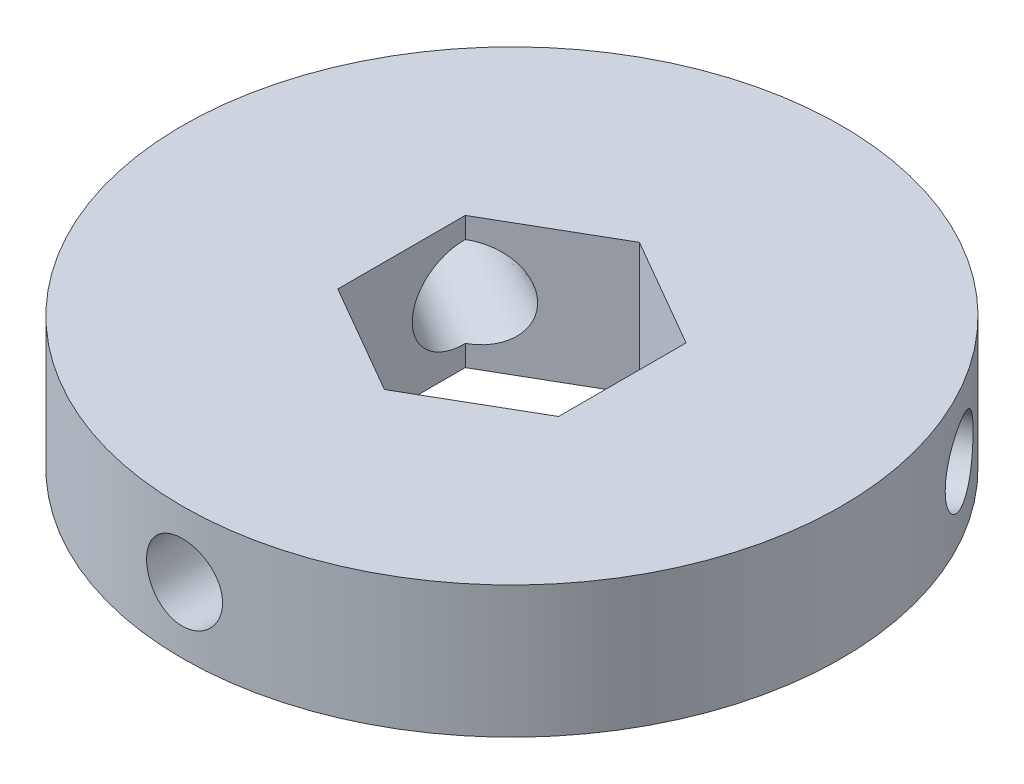
ISO-10303-21;
HEADER;
FILE_DESCRIPTION(('STEP AP214'),'2;1');
FILE_NAME('part.step','',(''),(''),'','','');
FILE_SCHEMA(('AUTOMOTIVE_DESIGN { 1 0 10303 214 1 1 1 1 }'));
ENDSEC;
DATA;
#1=APPLICATION_CONTEXT('core data for automotive mechanical design processes');
#2=APPLICATION_PROTOCOL_DEFINITION('international standard','automotive_design',2000,#1);
#3=PRODUCT_CONTEXT('',#1,'mechanical');
#4=PRODUCT('Part','Part','',(#3));
#5=PRODUCT_RELATED_PRODUCT_CATEGORY('part','',(#4));
#6=PRODUCT_DEFINITION_FORMATION('','',#4);
#7=PRODUCT_DEFINITION_CONTEXT('part definition',#1,'design');
#8=PRODUCT_DEFINITION('design','',#6,#7);
#9=PRODUCT_DEFINITION_SHAPE('','',#8);
#10=(LENGTH_UNIT() NAMED_UNIT(*) SI_UNIT(.MILLI.,.METRE.));
#11=(NAMED_UNIT(*) PLANE_ANGLE_UNIT() SI_UNIT($,.RADIAN.));
#12=(NAMED_UNIT(*) SI_UNIT($,.STERADIAN.) SOLID_ANGLE_UNIT());
#13=UNCERTAINTY_MEASURE_WITH_UNIT(LENGTH_MEASURE(1.E-05),#10,'distance_accuracy_value','');
#14=(GEOMETRIC_REPRESENTATION_CONTEXT(3) GLOBAL_UNCERTAINTY_ASSIGNED_CONTEXT((#13)) GLOBAL_UNIT_ASSIGNED_CONTEXT((#10,
#11,#12)) REPRESENTATION_CONTEXT('',''));
#15=CARTESIAN_POINT('',(0.,0.,0.));
#16=DIRECTION('',(0.,0.,1.));
#17=DIRECTION('',(1.,0.,0.));
#18=AXIS2_PLACEMENT_3D('',#15,#16,#17);
#19=CARTESIAN_POINT('',(0.,2.,0.));
#20=DIRECTION('',(0.,-1.,0.));
#21=DIRECTION('',(0.,0.,-1.));
#22=AXIS2_PLACEMENT_3D('',#19,#20,#21);
#23=CYLINDRICAL_SURFACE('',#22,10.);
#24=CARTESIAN_POINT('',(0.,2.,0.));
#25=DIRECTION('',(0.,1.,0.));
#26=DIRECTION('',(0.,0.,1.));
#27=AXIS2_PLACEMENT_3D('',#24,#25,#26);
#28=CIRCLE('',#27,10.);
#29=CARTESIAN_POINT('',(0.,2.,10.));
#30=VERTEX_POINT('',#29);
#31=EDGE_CURVE('E146',#30,#30,#28,.T.);
#32=ORIENTED_EDGE('',*,*,#31,.F.);
#33=EDGE_LOOP('',(#32));
#34=FACE_BOUND('',#33,.T.);
#35=CARTESIAN_POINT('',(0.,-2.,0.));
#36=DIRECTION('',(0.,1.,0.));
#37=DIRECTION('',(0.,0.,1.));
#38=AXIS2_PLACEMENT_3D('',#35,#36,#37);
#39=CIRCLE('',#38,10.);
#40=CARTESIAN_POINT('',(0.,-2.,10.));
#41=VERTEX_POINT('',#40);
#42=EDGE_CURVE('E145',#41,#41,#39,.T.);
#43=ORIENTED_EDGE('',*,*,#42,.T.);
#44=EDGE_LOOP('',(#43));
#45=FACE_BOUND('',#44,.T.);
#46=CARTESIAN_POINT('',(-0.831466883380527,-0.797352041237193,9.96537319029456));
#47=CARTESIAN_POINT('',(-0.87623135680235,-0.750857048698407,9.96163827593498));
#48=CARTESIAN_POINT('',(-0.917108542852066,-0.700561462114175,9.95792348569143));
#49=CARTESIAN_POINT('',(-0.98989355918561,-0.593769515069177,9.95095250017821));
#50=CARTESIAN_POINT('',(-1.02179215921711,-0.537266855889508,9.94769677854763));
#51=CARTESIAN_POINT('',(-1.07565928041342,-0.419672101911003,9.94201657930877));
#52=CARTESIAN_POINT('',(-1.09762891993868,-0.358580524894907,9.9395920080903));
#53=CARTESIAN_POINT('',(-1.13098213369277,-0.233555640429572,9.93585245919196));
#54=CARTESIAN_POINT('',(-1.14236836978836,-0.169623051773581,9.93453720251244));
#55=CARTESIAN_POINT('',(-1.15418879847582,-0.0410990034503923,9.93317089798296));
#56=CARTESIAN_POINT('',(-1.15468355758256,0.0234868133257319,9.933112858889));
#57=CARTESIAN_POINT('',(-1.14486019420359,0.151820507987677,9.93424978804994));
#58=CARTESIAN_POINT('',(-1.13454188586373,0.215568371451754,9.93544477784179));
#59=CARTESIAN_POINT('',(-1.10344545826133,0.340232697401939,9.9389460974761));
#60=CARTESIAN_POINT('',(-1.08269708389839,0.401156676527566,9.94124926617163));
#61=CARTESIAN_POINT('',(-1.03136149359407,0.518666218396538,9.94670579047661));
#62=CARTESIAN_POINT('',(-1.00077395599945,0.575251639232661,9.94985917387998));
#63=CARTESIAN_POINT('',(-0.930430663575174,0.682831863623349,9.95668368786477));
#64=CARTESIAN_POINT('',(-0.89062363790302,0.733792958102964,9.96035766746816));
#65=CARTESIAN_POINT('',(-0.803060205671823,0.828347101472137,9.96779917254997));
#66=CARTESIAN_POINT('',(-0.755303498129143,0.871939871262885,9.97156670156568));
#67=CARTESIAN_POINT('',(-0.652843774194066,0.950803816118998,9.97879974375043));
#68=CARTESIAN_POINT('',(-0.598098651713221,0.986020499490011,9.98226319146768));
#69=CARTESIAN_POINT('',(-0.483441352062913,1.04677761167011,9.98847217860723));
#70=CARTESIAN_POINT('',(-0.42352921296792,1.07231811177312,9.99121772331898));
#71=CARTESIAN_POINT('',(-0.30028371262004,1.1129719978223,9.99568035658648));
#72=CARTESIAN_POINT('',(-0.236953247847999,1.12809406666803,9.99739830140385));
#73=CARTESIAN_POINT('',(-0.108633066778872,1.14750295635954,9.99961572818127));
#74=CARTESIAN_POINT('',(-0.0436434026426832,1.15179011740389,10.0001152483979));
#75=CARTESIAN_POINT('',(0.0858363813923547,1.14940928921731,9.99984024739126));
#76=CARTESIAN_POINT('',(0.150327430578437,1.14279083905639,9.99907148735027));
#77=CARTESIAN_POINT('',(0.277274862998776,1.11888616963386,9.99635689712735));
#78=CARTESIAN_POINT('',(0.339731239195363,1.10159991347781,9.99441106287454));
#79=CARTESIAN_POINT('',(0.460855699955949,1.05685539794539,9.98955902702158));
#80=CARTESIAN_POINT('',(0.519523256622255,1.02939572467814,9.98665269193811));
#81=CARTESIAN_POINT('',(0.631423258813606,0.965082406181372,9.98020289726765));
#82=CARTESIAN_POINT('',(0.684655518615473,0.928228440100788,9.9766594159209));
#83=CARTESIAN_POINT('',(0.784431952376467,0.845964962773647,9.96931215974208));
#84=CARTESIAN_POINT('',(0.830944424786302,0.800517093457773,9.96550726857214));
#85=CARTESIAN_POINT('',(0.915678947661903,0.702442913407562,9.95807942654568));
#86=CARTESIAN_POINT('',(0.953900936144161,0.649816549008253,9.95445647704959));
#87=CARTESIAN_POINT('',(1.02097931127845,0.538822646272109,9.94780088270349));
#88=CARTESIAN_POINT('',(1.0498304044078,0.48045188715767,9.94476857188498));
#89=CARTESIAN_POINT('',(1.09728936960824,0.359646246058115,9.93964433577026));
#90=CARTESIAN_POINT('',(1.11589770658622,0.297211548674334,9.93755236779376));
#91=CARTESIAN_POINT('',(1.14222732363463,0.170485527314597,9.9345605377322));
#92=CARTESIAN_POINT('',(1.15001894684696,0.106209000462936,9.93365297556917));
#93=CARTESIAN_POINT('',(1.15470761139663,-0.0227443445651024,9.9331091033533));
#94=CARTESIAN_POINT('',(1.15160504938089,-0.0874211480822014,9.93347274701707));
#95=CARTESIAN_POINT('',(1.13464641472022,-0.214971651072027,9.9354239074038));
#96=CARTESIAN_POINT('',(1.12084855713302,-0.277853207025768,9.93700479827652));
#97=CARTESIAN_POINT('',(1.08297843920569,-0.400404860628441,9.94120303282282));
#98=CARTESIAN_POINT('',(1.05890598532181,-0.460074897757776,9.94382039602048));
#99=CARTESIAN_POINT('',(1.00108962642963,-0.574730689842418,9.94980717820899));
#100=CARTESIAN_POINT('',(0.967314550475386,-0.629700594349948,9.95317901319412));
#101=CARTESIAN_POINT('',(0.89108432443883,-0.73322404491863,9.9602926485895));
#102=CARTESIAN_POINT('',(0.848628765494832,-0.781777288569555,9.96403446642211));
#103=CARTESIAN_POINT('',(0.755880755283127,-0.871464597261614,9.97150037066761));
#104=CARTESIAN_POINT('',(0.705533025175442,-0.912541540803229,9.97522412490221));
#105=CARTESIAN_POINT('',(0.59864096128138,-0.985685693056444,9.98220883162894));
#106=CARTESIAN_POINT('',(0.542096559036923,-1.01775280221745,9.98546977900729));
#107=CARTESIAN_POINT('',(0.424290318680589,-1.07201848393992,9.99116898730048));
#108=CARTESIAN_POINT('',(0.363020122611525,-1.09419907912126,9.99360574761098));
#109=CARTESIAN_POINT('',(0.237596135410269,-1.12796246853576,9.99737372093048));
#110=CARTESIAN_POINT('',(0.17344252984597,-1.13954594374724,9.99870500497766));
#111=CARTESIAN_POINT('',(0.04437228090468,-1.15175045134875,10.0001088796741));
#112=CARTESIAN_POINT('',(-0.0205397782112637,-1.15241937047757,10.0001869685917));
#113=CARTESIAN_POINT('',(-0.149565892844728,-1.14289587250054,9.99908961984763));
#114=CARTESIAN_POINT('',(-0.213679784145377,-1.1327012564824,9.99791392840558));
#115=CARTESIAN_POINT('',(-0.339165742569385,-1.10177454477811,9.99444365695216));
#116=CARTESIAN_POINT('',(-0.400542024888607,-1.08105930352783,9.99215086681288));
#117=CARTESIAN_POINT('',(-0.518898016790839,-1.02970390722413,9.98670370541665));
#118=CARTESIAN_POINT('',(-0.575882102139896,-0.999073792420861,9.98355020625709));
#119=CARTESIAN_POINT('',(-0.666499875857055,-0.940104753797526,9.97783206554103));
#120=CARTESIAN_POINT('',(-0.701749787932262,-0.914196421597137,9.97540415923138));
#121=CARTESIAN_POINT('',(-0.769082504346506,-0.858556577954024,9.97043882546524));
#122=CARTESIAN_POINT('',(-0.801165289645521,-0.828825043529578,9.96790139735046));
#123=CARTESIAN_POINT('',(-0.831466883380527,-0.797352041237193,9.96537319029456));
#124=B_SPLINE_CURVE_WITH_KNOTS('',3,(#46,#47,#48,#49,#50,#51,#52,#53,#54,#55,#56,#57,#58,#59,
#60,#61,#62,#63,#64,#65,#66,#67,#68,#69,#70,#71,#72,#73,#74,#75,#76,#77,#78,#79,#80,#81,#82,#83,
#84,#85,#86,#87,#88,#89,#90,#91,#92,#93,#94,#95,#96,#97,#98,#99,#100,#101,#102,#103,#104,#105,
#106,#107,#108,#109,#110,#111,#112,#113,#114,#115,#116,#117,#118,#119,#120,#121,#122,#123),
.UNSPECIFIED.,.T.,.F.,(4,2,2,2,2,2,2,2,2,2,2,2,2,2,2,2,2,2,2,2,2,2,2,2,2,2,2,2,2,2,2,2,2,2,2,2,
2,2,4),(0.,0.193791440646984,0.387781383006681,0.581749469625854,0.775668757479188,
0.968509403704672,1.1613533645142,1.35365045859547,1.54595383972269,1.73935347644252,
1.93276043714991,2.12739317401012,2.32202447679227,2.51649337364121,2.7109561644056,
2.90453803488596,3.09812057486987,3.29173002885138,3.48534609622298,3.67984767031398,
3.87435069853895,4.06896340920976,4.2635672859056,4.45689959233673,4.65022485979568,
4.8425051738159,5.03478911000247,5.2276978274229,5.42061563318102,5.6149506155124,
5.80928774498675,6.00397682463103,6.19865339254056,6.3924756018291,6.5863370505552,
6.77988890107313,6.97324536218295,7.10442425819293,7.23560394277163),.UNSPECIFIED.);
#125=CARTESIAN_POINT('',(-0.831466883380527,-0.797352041237193,9.96537319029456));
#126=VERTEX_POINT('',#125);
#127=EDGE_CURVE('E200',#126,#126,#124,.T.);
#128=ORIENTED_EDGE('',*,*,#127,.T.);
#129=EDGE_LOOP('',(#128));
#130=FACE_BOUND('',#129,.T.);
#131=CARTESIAN_POINT('',(8.20278613480044,-0.775504863867642,-5.71964156453232));
#132=CARTESIAN_POINT('',(8.22787041063433,-0.82331256414443,-5.68366663721242));
#133=CARTESIAN_POINT('',(8.25503871148999,-0.867454699141313,-5.64419763801794));
#134=CARTESIAN_POINT('',(8.31249792657882,-0.94713446776008,-5.5592272737865));
#135=CARTESIAN_POINT('',(8.34279221288465,-0.982662668034247,-5.51371937899981));
#136=CARTESIAN_POINT('',(8.40537385464649,-1.0440628408934,-5.41783738925405));
#137=CARTESIAN_POINT('',(8.4376606203705,-1.0699376548543,-5.36746473169241));
#138=CARTESIAN_POINT('',(8.50310918758371,-1.11129052919814,-5.26316640271389));
#139=CARTESIAN_POINT('',(8.53627076320469,-1.12677124646271,-5.2092416431387));
#140=CARTESIAN_POINT('',(8.60230592204471,-1.14686603726225,-5.09945319411592));
#141=CARTESIAN_POINT('',(8.63518006335676,-1.15151169844511,-5.04359562383603));
#142=CARTESIAN_POINT('',(8.69976076323537,-1.14989217048708,-4.9313643529535));
#143=CARTESIAN_POINT('',(8.7314672991363,-1.14362676965397,-4.87499064235801));
#144=CARTESIAN_POINT('',(8.79276633195732,-1.12040427711256,-4.76353806627544));
#145=CARTESIAN_POINT('',(8.82236494121619,-1.10347962699921,-4.70845579601304));
#146=CARTESIAN_POINT('',(8.87885819449768,-1.05945616446872,-4.60103932995471));
#147=CARTESIAN_POINT('',(8.90575278182214,-1.03235713877082,-4.54870519179283));
#148=CARTESIAN_POINT('',(8.95637154224077,-0.968654380796716,-4.44821176271667));
#149=CARTESIAN_POINT('',(8.98008577169018,-0.932021844894344,-4.4000657238602));
#150=CARTESIAN_POINT('',(9.02384108490651,-0.850316610596225,-4.30961956004189));
#151=CARTESIAN_POINT('',(9.04388206722702,-0.805243679166116,-4.26731959654281));
#152=CARTESIAN_POINT('',(9.08007117173473,-0.707726254411297,-4.18976731639185));
#153=CARTESIAN_POINT('',(9.09620459196406,-0.655255061535846,-4.15454169886029));
#154=CARTESIAN_POINT('',(9.12428626926968,-0.54453711238845,-4.09250096987296));
#155=CARTESIAN_POINT('',(9.13623460944737,-0.486290470826672,-4.06568569141768));
#156=CARTESIAN_POINT('',(9.15578973195488,-0.365867047821986,-4.02145505646677));
#157=CARTESIAN_POINT('',(9.16341059747534,-0.303703754978806,-4.00400921854089));
#158=CARTESIAN_POINT('',(9.17429978642677,-0.177052651743077,-3.97899634853969));
#159=CARTESIAN_POINT('',(9.17756833469377,-0.112564961603164,-3.97142880616266));
#160=CARTESIAN_POINT('',(9.17971695231073,0.0163945856426374,-3.96645988609919));
#161=CARTESIAN_POINT('',(9.1786292667674,0.080863039512024,-3.96898381053067));
#162=CARTESIAN_POINT('',(9.17214739409556,0.208418054030982,-3.98393992550446));
#163=CARTESIAN_POINT('',(9.16675325097757,0.271504628796119,-3.99637201478867));
#164=CARTESIAN_POINT('',(9.15171755113368,0.394417766049763,-4.03068395126429));
#165=CARTESIAN_POINT('',(9.14208233599815,0.454249046595947,-4.05254969154121));
#166=CARTESIAN_POINT('',(9.11865814004208,0.569090462976499,-4.10498408228063));
#167=CARTESIAN_POINT('',(9.10486899409236,0.624100407038394,-4.13555307871676));
#168=CARTESIAN_POINT('',(9.0731841584083,0.728124758766864,-4.20461380120021));
#169=CARTESIAN_POINT('',(9.05526243693794,0.777098004880454,-4.24315558359026));
#170=CARTESIAN_POINT('',(9.01559463072858,0.867279088266366,-4.32679919120403));
#171=CARTESIAN_POINT('',(8.99384841462699,0.908486658704894,-4.37190124174863));
#172=CARTESIAN_POINT('',(8.94673717982641,0.982198236850432,-4.46752116934073));
#173=CARTESIAN_POINT('',(8.92135274338052,1.0146526617261,-4.51806771967048));
#174=CARTESIAN_POINT('',(8.86753226089328,1.06963091956233,-4.62280588770096));
#175=CARTESIAN_POINT('',(8.83909626189801,1.09215490559356,-4.6769974492016));
#176=CARTESIAN_POINT('',(8.77985545801057,1.12658884807314,-4.78727961326452));
#177=CARTESIAN_POINT('',(8.74905520853866,1.13851868592721,-4.8433664527691));
#178=CARTESIAN_POINT('',(8.68581947617623,1.1514866753247,-4.95587559590168));
#179=CARTESIAN_POINT('',(8.65338403970124,1.15252513585015,-5.0122978899676));
#180=CARTESIAN_POINT('',(8.58793961527934,1.14369975285265,-5.12361640975494));
#181=CARTESIAN_POINT('',(8.55493367485038,1.13388253364,-5.17851813170841));
#182=CARTESIAN_POINT('',(8.48923050652422,1.10370620737099,-5.28553783902994));
#183=CARTESIAN_POINT('',(8.45653328142604,1.08334700482796,-5.33765579917866));
#184=CARTESIAN_POINT('',(8.39249380806641,1.03264251146862,-5.43779250471684));
#185=CARTESIAN_POINT('',(8.3611531042276,1.00228616039829,-5.4858066354324));
#186=CARTESIAN_POINT('',(8.30096532540389,0.932449295579829,-5.57646299782075));
#187=CARTESIAN_POINT('',(8.27211834020062,0.892968453509472,-5.61910503610675));
#188=CARTESIAN_POINT('',(8.21786264484705,0.805780993167412,-5.6981617365443));
#189=CARTESIAN_POINT('',(8.19247018284805,0.758037750522584,-5.73454716919093));
#190=CARTESIAN_POINT('',(8.14627623549014,0.655781146757017,-5.79998210079753));
#191=CARTESIAN_POINT('',(8.12547475285319,0.601267781622354,-5.82903159540808));
#192=CARTESIAN_POINT('',(8.08932945954285,0.487031054196816,-5.87909055756565));
#193=CARTESIAN_POINT('',(8.07398249944173,0.427310723284669,-5.9001046652587));
#194=CARTESIAN_POINT('',(8.04938948033078,0.304331009587472,-5.93361309421964));
#195=CARTESIAN_POINT('',(8.04014291473737,0.241071921138177,-5.94610812292425));
#196=CARTESIAN_POINT('',(8.02820128008216,0.113293202746097,-5.96222151738048));
#197=CARTESIAN_POINT('',(8.02545979030755,0.0487858365804871,-5.96590278054241));
#198=CARTESIAN_POINT('',(8.02651477364916,-0.080092663646901,-5.96448332387064));
#199=CARTESIAN_POINT('',(8.03031246865501,-0.144463769997265,-5.95938096275909));
#200=CARTESIAN_POINT('',(8.04424929412836,-0.270957357430131,-5.94055450568415));
#201=CARTESIAN_POINT('',(8.05436336006126,-0.333087704379313,-5.92686448619513));
#202=CARTESIAN_POINT('',(8.08046917720776,-0.453580905965084,-5.89122245851452));
#203=CARTESIAN_POINT('',(8.0964549167582,-0.511947542446054,-5.86927890008887));
#204=CARTESIAN_POINT('',(8.12748914203006,-0.604960737939471,-5.82617974970661));
#205=CARTESIAN_POINT('',(8.14111358922223,-0.641090345773552,-5.8071430766075));
#206=CARTESIAN_POINT('',(8.17044886583204,-0.710518405056418,-5.76579649285977));
#207=CARTESIAN_POINT('',(8.18615970895034,-0.743816837911488,-5.74348656071668));
#208=CARTESIAN_POINT('',(8.20278613480044,-0.775504863867642,-5.71964156453232));
#209=B_SPLINE_CURVE_WITH_KNOTS('',3,(#131,#132,#133,#134,#135,#136,#137,#138,#139,#140,#141,
#142,#143,#144,#145,#146,#147,#148,#149,#150,#151,#152,#153,#154,#155,#156,#157,#158,#159,#160,
#161,#162,#163,#164,#165,#166,#167,#168,#169,#170,#171,#172,#173,#174,#175,#176,#177,#178,#179,
#180,#181,#182,#183,#184,#185,#186,#187,#188,#189,#190,#191,#192,#193,#194,#195,#196,#197,#198,
#199,#200,#201,#202,#203,#204,#205,#206,#207,#208),.UNSPECIFIED.,.T.,.F.,(4,2,2,2,2,2,2,2,2,2,2,
2,2,2,2,2,2,2,2,2,2,2,2,2,2,2,2,2,2,2,2,2,2,2,2,2,2,2,4),(0.,0.194474174848252,
0.389160371159416,0.583789218277826,0.77836829648512,0.972379401626992,1.16639427093958,
1.35982148767087,1.55325275935474,1.74727537084403,1.94130333997365,2.13605036555356,
2.33079352390306,2.52489922994084,2.71899490829791,2.91165654382604,3.10431621044276,
3.29668877038825,3.48906897863522,3.68269582748204,3.87632932826385,4.07103768017461,
4.26574303068937,4.46008221238106,4.65441588076837,4.84791813158781,5.04142213513332,
5.23514094331783,5.42886672307994,5.62347431083972,5.81808201398058,6.01257716786856,
6.2070561686277,6.40014312303832,6.59326616093008,6.78562767798105,6.97779279382006,
7.10669383268885,7.23559571804862),.UNSPECIFIED.);
#210=CARTESIAN_POINT('',(8.20278613480044,-0.775504863867642,-5.71964156453232));
#211=VERTEX_POINT('',#210);
#212=EDGE_CURVE('E251',#211,#211,#209,.T.);
#213=ORIENTED_EDGE('',*,*,#212,.T.);
#214=EDGE_LOOP('',(#213));
#215=FACE_BOUND('',#214,.T.);
#216=CARTESIAN_POINT('',(-8.30548080465958,-0.936205013784656,-5.5694693287091));
#217=CARTESIAN_POINT('',(-8.27605839180298,-0.89860104033586,-5.61334515353982));
#218=CARTESIAN_POINT('',(-8.24802899588716,-0.856530544802915,-5.65438841289391));
#219=CARTESIAN_POINT('',(-8.19583676964329,-0.764631479970653,-5.7297794848485));
#220=CARTESIAN_POINT('',(-8.17167814776464,-0.714794581286142,-5.76412001872675));
#221=CARTESIAN_POINT('',(-8.12821709960073,-0.608783183594706,-5.82524644037993));
#222=CARTESIAN_POINT('',(-8.10891355649026,-0.552610146418972,-5.85203406574012));
#223=CARTESIAN_POINT('',(-8.07596791663362,-0.43551308114285,-5.897417483144));
#224=CARTESIAN_POINT('',(-8.06232436071429,-0.374590282372226,-5.9160153866153));
#225=CARTESIAN_POINT('',(-8.04132817956995,-0.249987637070197,-5.94452316967491));
#226=CARTESIAN_POINT('',(-8.03394857194056,-0.186320869980196,-5.95447031761138));
#227=CARTESIAN_POINT('',(-8.02570740111476,-0.0578085573271671,-5.96557372756948));
#228=CARTESIAN_POINT('',(-8.02484579089524,0.00703697972841853,-5.96673005301119));
#229=CARTESIAN_POINT('',(-8.0296628895974,0.135612299905711,-5.96024571801996));
#230=CARTESIAN_POINT('',(-8.03529874560841,0.199346611247325,-5.95266269654403));
#231=CARTESIAN_POINT('',(-8.05279322731521,0.324327588806824,-5.92897425620975));
#232=CARTESIAN_POINT('',(-8.06465189029443,0.385574240117734,-5.91286878628987));
#233=CARTESIAN_POINT('',(-8.09410481329736,0.503947935639075,-5.87248576013595));
#234=CARTESIAN_POINT('',(-8.11170709625475,0.56106908005898,-5.84819677125908));
#235=CARTESIAN_POINT('',(-8.15191462290437,0.669519535589931,-5.79201837192468));
#236=CARTESIAN_POINT('',(-8.17452008601014,0.72084859254094,-5.76012862813272));
#237=CARTESIAN_POINT('',(-8.22402195401694,0.81666082614151,-5.6892302617859));
#238=CARTESIAN_POINT('',(-8.25094872243525,0.86109082374241,-5.65017096045804));
#239=CARTESIAN_POINT('',(-8.30794262434762,0.941413154144029,-5.5660279218358));
#240=CARTESIAN_POINT('',(-8.33800982500298,0.977305304300445,-5.52094405569427));
#241=CARTESIAN_POINT('',(-8.40029839214281,1.03965186200424,-5.42570100274837));
#242=CARTESIAN_POINT('',(-8.43252679814915,1.06607345359996,-5.37552492706245));
#243=CARTESIAN_POINT('',(-8.49792587444718,1.10854528165189,-5.27152970329776));
#244=CARTESIAN_POINT('',(-8.53109651935569,1.1245957972207,-5.21771065330395));
#245=CARTESIAN_POINT('',(-8.59718064900908,1.14581871379847,-5.10808816845187));
#246=CARTESIAN_POINT('',(-8.63009462961844,1.15103005595669,-5.05229257221878));
#247=CARTESIAN_POINT('',(-8.69480131491928,1.15053787815306,-4.94010356239016));
#248=CARTESIAN_POINT('',(-8.72659404173167,1.14483457364602,-4.88371016061715));
#249=CARTESIAN_POINT('',(-8.7881017180001,1.12271613173554,-4.77213948978419));
#250=CARTESIAN_POINT('',(-8.8178228792764,1.10633469180247,-4.71695895759608));
#251=CARTESIAN_POINT('',(-8.87459357732111,1.06336519801882,-4.60926213817082));
#252=CARTESIAN_POINT('',(-8.90164305445008,1.03677691638777,-4.55674591042109));
#253=CARTESIAN_POINT('',(-8.95259323834057,0.974055141227605,-4.4558145721665));
#254=CARTESIAN_POINT('',(-8.97648450513162,0.937893959998828,-4.40741190459518));
#255=CARTESIAN_POINT('',(-9.02061276499084,0.857074750280448,-4.31637682805791));
#256=CARTESIAN_POINT('',(-9.04084964872859,0.812416467659869,-4.27374459173908));
#257=CARTESIAN_POINT('',(-9.07744657211849,0.71565657260781,-4.19545502319359));
#258=CARTESIAN_POINT('',(-9.09379154929593,0.663527252987039,-4.15982488047154));
#259=CARTESIAN_POINT('',(-9.12230474494792,0.553412700404205,-4.09691998678628));
#260=CARTESIAN_POINT('',(-9.13447304457992,0.495427581255106,-4.06964507347288));
#261=CARTESIAN_POINT('',(-9.15447463474595,0.375425256256621,-4.02445109385606));
#262=CARTESIAN_POINT('',(-9.1623211260273,0.313420982580599,-4.00650354716675));
#263=CARTESIAN_POINT('',(-9.17366258879263,0.186992422966552,-3.98046716879871));
#264=CARTESIAN_POINT('',(-9.17715778267704,0.122568260885554,-3.9723778332545));
#265=CARTESIAN_POINT('',(-9.17975695310875,-0.00636038192192329,-3.96636774655876));
#266=CARTESIAN_POINT('',(-9.17889327361264,-0.0708607308062526,-3.96837209742839));
#267=CARTESIAN_POINT('',(-9.17285666135438,-0.198573603160879,-3.98230550467139));
#268=CARTESIAN_POINT('',(-9.16768378384147,-0.261786143131832,-3.9942344337994));
#269=CARTESIAN_POINT('',(-9.15308722422499,-0.385025191756325,-4.02757020614368));
#270=CARTESIAN_POINT('',(-9.14367090674276,-0.445057019751531,-4.04896062746454));
#271=CARTESIAN_POINT('',(-9.12067913337169,-0.56038318246144,-4.10048828744542));
#272=CARTESIAN_POINT('',(-9.10710350843303,-0.615677324501965,-4.13062588162061));
#273=CARTESIAN_POINT('',(-9.07584016559923,-0.720340847817974,-4.19887346376741));
#274=CARTESIAN_POINT('',(-9.0581268525783,-0.769670325553901,-4.23703292043303));
#275=CARTESIAN_POINT('',(-9.01886305094918,-0.860632174924688,-4.31997800801276));
#276=CARTESIAN_POINT('',(-8.99731242113392,-0.902264263193075,-4.36476388275811));
#277=CARTESIAN_POINT('',(-8.95057045484287,-0.976891037959554,-4.45983244264522));
#278=CARTESIAN_POINT('',(-8.92535900824656,-1.00983498221255,-4.51014509009368));
#279=CARTESIAN_POINT('',(-8.87185736130167,-1.06583341358684,-4.61449679315246));
#280=CARTESIAN_POINT('',(-8.84356730762124,-1.08888837157171,-4.66853567119626));
#281=CARTESIAN_POINT('',(-8.78457983412735,-1.12441304816724,-4.77860296281571));
#282=CARTESIAN_POINT('',(-8.75388683163921,-1.13690171372706,-4.83462762675071));
#283=CARTESIAN_POINT('',(-8.69081383576479,-1.15099819276769,-4.94711141209537));
#284=CARTESIAN_POINT('',(-8.65843352954087,-1.15260398120362,-5.00357061240531));
#285=CARTESIAN_POINT('',(-8.59303944245228,-1.14490090227023,-5.1150597464006));
#286=CARTESIAN_POINT('',(-8.56002864522679,-1.13563483068652,-5.17009441840425));
#287=CARTESIAN_POINT('',(-8.4942856820872,-1.1065309388093,-5.27741068268081));
#288=CARTESIAN_POINT('',(-8.4615532625077,-1.0867041026492,-5.32969507352179));
#289=CARTESIAN_POINT('',(-8.40801126369608,-1.04526887580169,-5.41358968221985));
#290=CARTESIAN_POINT('',(-8.38682415805113,-1.02639592739463,-5.44633939200242));
#291=CARTESIAN_POINT('',(-8.3453781024867,-0.98441361847023,-5.50963648939477));
#292=CARTESIAN_POINT('',(-8.32511915495835,-0.961304247039677,-5.54018387133098));
#293=CARTESIAN_POINT('',(-8.30548080465958,-0.936205013784656,-5.5694693287091));
#294=B_SPLINE_CURVE_WITH_KNOTS('',3,(#216,#217,#218,#219,#220,#221,#222,#223,#224,#225,#226,
#227,#228,#229,#230,#231,#232,#233,#234,#235,#236,#237,#238,#239,#240,#241,#242,#243,#244,#245,
#246,#247,#248,#249,#250,#251,#252,#253,#254,#255,#256,#257,#258,#259,#260,#261,#262,#263,#264,
#265,#266,#267,#268,#269,#270,#271,#272,#273,#274,#275,#276,#277,#278,#279,#280,#281,#282,#283,
#284,#285,#286,#287,#288,#289,#290,#291,#292,#293),.UNSPECIFIED.,.T.,.F.,(4,2,2,2,2,2,2,2,2,2,2,
2,2,2,2,2,2,2,2,2,2,2,2,2,2,2,2,2,2,2,2,2,2,2,2,2,2,2,4),(0.,0.194377000719938,
0.388963921921759,0.583506040812407,0.777997974551644,0.97164780623124,1.16529624085167,
1.35767477194574,1.55005445567272,1.74270402224361,1.93536203910063,2.12943834578481,
2.32351880383678,2.5182654033161,2.71300676144037,2.90704726868454,3.10108394561437,
3.29451123756088,3.48794284636887,3.68194014857592,3.87594325375898,4.07068541154078,
4.26542378505402,4.45956399387275,4.65369427952681,4.84638619618423,5.03907564233133,
5.23143195026499,5.42379607731541,5.6173832174981,5.81097748284807,6.00567855873842,
6.2003703629175,6.39471231105422,6.58909042061782,6.78270594378117,6.97612048169964,
7.10585946045945,7.23559877343722),.UNSPECIFIED.);
#295=CARTESIAN_POINT('',(-8.30548080465958,-0.936205013784656,-5.5694693287091));
#296=VERTEX_POINT('',#295);
#297=EDGE_CURVE('E120',#296,#296,#294,.T.);
#298=ORIENTED_EDGE('',*,*,#297,.T.);
#299=EDGE_LOOP('',(#298));
#300=FACE_BOUND('',#299,.T.);
#301=ADVANCED_FACE('F41',(#34,#45,#130,#215,#300),#23,.T.);
#302=CARTESIAN_POINT('',(0.,2.,0.));
#303=DIRECTION('',(0.,1.,0.));
#304=DIRECTION('',(0.,0.,1.));
#305=AXIS2_PLACEMENT_3D('',#302,#303,#304);
#306=PLANE('',#305);
#307=ORIENTED_EDGE('',*,*,#31,.T.);
#308=EDGE_LOOP('',(#307));
#309=FACE_BOUND('',#308,.T.);
#310=DIRECTION('',(-0.866025403784439,0.,0.5));
#311=VECTOR('',#310,1.);
#312=CARTESIAN_POINT('',(0.,2.,-3.86824680357049));
#313=LINE('',#312,#311);
#314=CARTESIAN_POINT('',(0.,2.,-3.86824680357049));
#315=VERTEX_POINT('',#314);
#316=CARTESIAN_POINT('',(-3.35,2.,-1.93412340178525));
#317=VERTEX_POINT('',#316);
#318=EDGE_CURVE('E174',#315,#317,#313,.T.);
#319=ORIENTED_EDGE('',*,*,#318,.F.);
#320=DIRECTION('',(-0.866025403784439,0.,-0.5));
#321=VECTOR('',#320,1.);
#322=CARTESIAN_POINT('',(3.35,2.,-1.93412340178525));
#323=LINE('',#322,#321);
#324=CARTESIAN_POINT('',(3.35,2.,-1.93412340178525));
#325=VERTEX_POINT('',#324);
#326=EDGE_CURVE('E194',#325,#315,#323,.T.);
#327=ORIENTED_EDGE('',*,*,#326,.F.);
#328=DIRECTION('',(0.,0.,-1.));
#329=VECTOR('',#328,1.);
#330=CARTESIAN_POINT('',(3.35,2.,1.93412340178525));
#331=LINE('',#330,#329);
#332=CARTESIAN_POINT('',(3.35,2.,1.93412340178525));
#333=VERTEX_POINT('',#332);
#334=EDGE_CURVE('E124',#333,#325,#331,.T.);
#335=ORIENTED_EDGE('',*,*,#334,.F.);
#336=DIRECTION('',(0.866025403784439,0.,-0.5));
#337=VECTOR('',#336,1.);
#338=CARTESIAN_POINT('',(0.,2.,3.86824680357049));
#339=LINE('',#338,#337);
#340=CARTESIAN_POINT('',(0.,2.,3.86824680357049));
#341=VERTEX_POINT('',#340);
#342=EDGE_CURVE('E170',#341,#333,#339,.T.);
#343=ORIENTED_EDGE('',*,*,#342,.F.);
#344=DIRECTION('',(0.866025403784439,0.,0.5));
#345=VECTOR('',#344,1.);
#346=CARTESIAN_POINT('',(-3.35,2.,1.93412340178525));
#347=LINE('',#346,#345);
#348=CARTESIAN_POINT('',(-3.35,2.,1.93412340178525));
#349=VERTEX_POINT('',#348);
#350=EDGE_CURVE('E166',#349,#341,#347,.T.);
#351=ORIENTED_EDGE('',*,*,#350,.F.);
#352=DIRECTION('',(0.,0.,1.));
#353=VECTOR('',#352,1.);
#354=CARTESIAN_POINT('',(-3.35,2.,-1.93412340178525));
#355=LINE('',#354,#353);
#356=EDGE_CURVE('E171',#317,#349,#355,.T.);
#357=ORIENTED_EDGE('',*,*,#356,.F.);
#358=EDGE_LOOP('',(#319,#327,#335,#343,#351,#357));
#359=FACE_BOUND('',#358,.T.);
#360=ADVANCED_FACE('F230',(#309,#359),#306,.T.);
#361=CARTESIAN_POINT('',(0.,-2.,0.));
#362=DIRECTION('',(0.,1.,0.));
#363=DIRECTION('',(0.,0.,1.));
#364=AXIS2_PLACEMENT_3D('',#361,#362,#363);
#365=PLANE('',#364);
#366=ORIENTED_EDGE('',*,*,#42,.F.);
#367=EDGE_LOOP('',(#366));
#368=FACE_BOUND('',#367,.T.);
#369=DIRECTION('',(-0.866025403784439,0.,-0.5));
#370=VECTOR('',#369,1.);
#371=CARTESIAN_POINT('',(3.35,-2.,-1.93412340178525));
#372=LINE('',#371,#370);
#373=CARTESIAN_POINT('',(3.35,-2.,-1.93412340178525));
#374=VERTEX_POINT('',#373);
#375=CARTESIAN_POINT('',(0.,-2.,-3.86824680357049));
#376=VERTEX_POINT('',#375);
#377=EDGE_CURVE('E179',#374,#376,#372,.T.);
#378=ORIENTED_EDGE('',*,*,#377,.T.);
#379=DIRECTION('',(-0.866025403784439,0.,0.5));
#380=VECTOR('',#379,1.);
#381=CARTESIAN_POINT('',(0.,-2.,-3.86824680357049));
#382=LINE('',#381,#380);
#383=CARTESIAN_POINT('',(-3.35,-2.,-1.93412340178525));
#384=VERTEX_POINT('',#383);
#385=EDGE_CURVE('E182',#376,#384,#382,.T.);
#386=ORIENTED_EDGE('',*,*,#385,.T.);
#387=DIRECTION('',(0.,0.,1.));
#388=VECTOR('',#387,1.);
#389=CARTESIAN_POINT('',(-3.35,-2.,-1.93412340178525));
#390=LINE('',#389,#388);
#391=CARTESIAN_POINT('',(-3.35,-2.,1.93412340178525));
#392=VERTEX_POINT('',#391);
#393=EDGE_CURVE('E185',#384,#392,#390,.T.);
#394=ORIENTED_EDGE('',*,*,#393,.T.);
#395=DIRECTION('',(0.866025403784439,0.,0.5));
#396=VECTOR('',#395,1.);
#397=CARTESIAN_POINT('',(-3.35,-2.,1.93412340178525));
#398=LINE('',#397,#396);
#399=CARTESIAN_POINT('',(0.,-2.,3.86824680357049));
#400=VERTEX_POINT('',#399);
#401=EDGE_CURVE('E188',#392,#400,#398,.T.);
#402=ORIENTED_EDGE('',*,*,#401,.T.);
#403=DIRECTION('',(0.866025403784439,0.,-0.5));
#404=VECTOR('',#403,1.);
#405=CARTESIAN_POINT('',(0.,-2.,3.86824680357049));
#406=LINE('',#405,#404);
#407=CARTESIAN_POINT('',(3.35,-2.,1.93412340178525));
#408=VERTEX_POINT('',#407);
#409=EDGE_CURVE('E190',#400,#408,#406,.T.);
#410=ORIENTED_EDGE('',*,*,#409,.T.);
#411=DIRECTION('',(0.,0.,-1.));
#412=VECTOR('',#411,1.);
#413=CARTESIAN_POINT('',(3.35,-2.,1.93412340178525));
#414=LINE('',#413,#412);
#415=EDGE_CURVE('E130',#408,#374,#414,.T.);
#416=ORIENTED_EDGE('',*,*,#415,.T.);
#417=EDGE_LOOP('',(#378,#386,#394,#402,#410,#416));
#418=FACE_BOUND('',#417,.T.);
#419=ADVANCED_FACE('F229',(#368,#418),#365,.F.);
#420=CARTESIAN_POINT('',(3.35,2.,-1.93412340178525));
#421=DIRECTION('',(-0.5,0.,0.866025403784439));
#422=DIRECTION('',(0.866025403784439,0.,0.5));
#423=AXIS2_PLACEMENT_3D('',#420,#421,#422);
#424=PLANE('',#423);
#425=DIRECTION('',(0.,-1.,0.));
#426=VECTOR('',#425,1.);
#427=CARTESIAN_POINT('',(3.35,2.,-1.93412340178525));
#428=LINE('',#427,#426);
#429=CARTESIAN_POINT('',(3.35,-1.36491784503532,-1.93412340178525));
#430=VERTEX_POINT('',#429);
#431=EDGE_CURVE('E119',#430,#374,#428,.T.);
#432=ORIENTED_EDGE('',*,*,#431,.F.);
#433=CARTESIAN_POINT('',(3.32246999690356,0.,-1.95001785648377));
#434=DIRECTION('',(-0.5,0.,0.866025403784439));
#435=DIRECTION('',(-0.866025403784439,0.,-0.5));
#436=AXIS2_PLACEMENT_3D('',#433,#434,#435);
#437=ELLIPSE('',#436,1.57671228310057,1.36519534012157);
#438=CARTESIAN_POINT('',(3.35,1.36491784503532,-1.93412340178525));
#439=VERTEX_POINT('',#438);
#440=EDGE_CURVE('E60',#430,#439,#437,.F.);
#441=ORIENTED_EDGE('',*,*,#440,.T.);
#442=EDGE_CURVE('E116',#325,#439,#428,.T.);
#443=ORIENTED_EDGE('',*,*,#442,.F.);
#444=ORIENTED_EDGE('',*,*,#326,.T.);
#445=DIRECTION('',(0.,-1.,0.));
#446=VECTOR('',#445,1.);
#447=CARTESIAN_POINT('',(0.,2.,-3.86824680357049));
#448=LINE('',#447,#446);
#449=EDGE_CURVE('E142',#315,#376,#448,.T.);
#450=ORIENTED_EDGE('',*,*,#449,.T.);
#451=ORIENTED_EDGE('',*,*,#377,.F.);
#452=EDGE_LOOP('',(#432,#441,#443,#444,#450,#451));
#453=FACE_BOUND('',#452,.T.);
#454=ADVANCED_FACE('F115',(#453),#424,.T.);
#455=CARTESIAN_POINT('',(0.,2.,-3.86824680357049));
#456=DIRECTION('',(0.5,0.,0.866025403784439));
#457=DIRECTION('',(0.866025403784439,0.,-0.5));
#458=AXIS2_PLACEMENT_3D('',#455,#456,#457);
#459=PLANE('',#458);
#460=DIRECTION('',(0.,-1.,0.));
#461=VECTOR('',#460,1.);
#462=CARTESIAN_POINT('',(-3.35,2.,-1.93412340178525));
#463=LINE('',#462,#461);
#464=CARTESIAN_POINT('',(-3.35,1.36491784503532,-1.93412340178525));
#465=VERTEX_POINT('',#464);
#466=EDGE_CURVE('E139',#317,#465,#463,.T.);
#467=ORIENTED_EDGE('',*,*,#466,.T.);
#468=CARTESIAN_POINT('',(-3.3224699969035,0.,-1.9500178564838));
#469=DIRECTION('',(0.5,0.,0.866025403784439));
#470=DIRECTION('',(0.866025403784439,0.,-0.5));
#471=AXIS2_PLACEMENT_3D('',#468,#469,#470);
#472=ELLIPSE('',#471,1.57671228310056,1.36519534012157);
#473=CARTESIAN_POINT('',(-3.35,-1.36491784503532,-1.93412340178525));
#474=VERTEX_POINT('',#473);
#475=EDGE_CURVE('E54',#465,#474,#472,.F.);
#476=ORIENTED_EDGE('',*,*,#475,.T.);
#477=EDGE_CURVE('E138',#474,#384,#463,.T.);
#478=ORIENTED_EDGE('',*,*,#477,.T.);
#479=ORIENTED_EDGE('',*,*,#385,.F.);
#480=ORIENTED_EDGE('',*,*,#449,.F.);
#481=ORIENTED_EDGE('',*,*,#318,.T.);
#482=EDGE_LOOP('',(#467,#476,#478,#479,#480,#481));
#483=FACE_BOUND('',#482,.T.);
#484=ADVANCED_FACE('F222',(#483),#459,.T.);
#485=CARTESIAN_POINT('',(-3.35,2.,-1.93412340178525));
#486=DIRECTION('',(1.,0.,0.));
#487=DIRECTION('',(0.,0.,-1.));
#488=AXIS2_PLACEMENT_3D('',#485,#486,#487);
#489=PLANE('',#488);
#490=ORIENTED_EDGE('',*,*,#477,.F.);
#491=CARTESIAN_POINT('',(-3.35,0.,-1.90233449238818));
#492=DIRECTION('',(1.,0.,0.));
#493=DIRECTION('',(0.,0.,1.));
#494=AXIS2_PLACEMENT_3D('',#491,#492,#493);
#495=ELLIPSE('',#494,1.57671228310057,1.36519534012157);
#496=EDGE_CURVE('E11',#474,#465,#495,.F.);
#497=ORIENTED_EDGE('',*,*,#496,.T.);
#498=ORIENTED_EDGE('',*,*,#466,.F.);
#499=ORIENTED_EDGE('',*,*,#356,.T.);
#500=DIRECTION('',(0.,-1.,0.));
#501=VECTOR('',#500,1.);
#502=CARTESIAN_POINT('',(-3.35,2.,1.93412340178525));
#503=LINE('',#502,#501);
#504=EDGE_CURVE('E136',#349,#392,#503,.T.);
#505=ORIENTED_EDGE('',*,*,#504,.T.);
#506=ORIENTED_EDGE('',*,*,#393,.F.);
#507=EDGE_LOOP('',(#490,#497,#498,#499,#505,#506));
#508=FACE_BOUND('',#507,.T.);
#509=ADVANCED_FACE('F219',(#508),#489,.T.);
#510=CARTESIAN_POINT('',(-3.35,2.,1.93412340178525));
#511=DIRECTION('',(0.5,0.,-0.866025403784439));
#512=DIRECTION('',(-0.866025403784439,0.,-0.5));
#513=AXIS2_PLACEMENT_3D('',#510,#511,#512);
#514=PLANE('',#513);
#515=DIRECTION('',(0.,-1.,0.));
#516=VECTOR('',#515,1.);
#517=CARTESIAN_POINT('',(0.,2.,3.86824680357049));
#518=LINE('',#517,#516);
#519=CARTESIAN_POINT('',(0.,1.36491784503533,3.86824680357049));
#520=VERTEX_POINT('',#519);
#521=EDGE_CURVE('E133',#341,#520,#518,.T.);
#522=ORIENTED_EDGE('',*,*,#521,.T.);
#523=CARTESIAN_POINT('',(-0.027530003096481,0.,3.85235234887195));
#524=DIRECTION('',(0.5,0.,-0.866025403784439));
#525=DIRECTION('',(-0.866025403784439,0.,-0.5));
#526=AXIS2_PLACEMENT_3D('',#523,#524,#525);
#527=ELLIPSE('',#526,1.57671228310056,1.36519534012157);
#528=CARTESIAN_POINT('',(0.,-1.36491784503532,3.86824680357049));
#529=VERTEX_POINT('',#528);
#530=EDGE_CURVE('E163',#520,#529,#527,.F.);
#531=ORIENTED_EDGE('',*,*,#530,.T.);
#532=EDGE_CURVE('E127',#529,#400,#518,.T.);
#533=ORIENTED_EDGE('',*,*,#532,.T.);
#534=ORIENTED_EDGE('',*,*,#401,.F.);
#535=ORIENTED_EDGE('',*,*,#504,.F.);
#536=ORIENTED_EDGE('',*,*,#350,.T.);
#537=EDGE_LOOP('',(#522,#531,#533,#534,#535,#536));
#538=FACE_BOUND('',#537,.T.);
#539=ADVANCED_FACE('F162',(#538),#514,.T.);
#540=CARTESIAN_POINT('',(0.,2.,3.86824680357049));
#541=DIRECTION('',(-0.5,0.,-0.866025403784439));
#542=DIRECTION('',(-0.866025403784439,0.,0.5));
#543=AXIS2_PLACEMENT_3D('',#540,#541,#542);
#544=PLANE('',#543);
#545=ORIENTED_EDGE('',*,*,#532,.F.);
#546=CARTESIAN_POINT('',(0.0275300030964812,0.,3.85235234887195));
#547=DIRECTION('',(-0.5,0.,-0.866025403784439));
#548=DIRECTION('',(0.866025403784439,0.,-0.5));
#549=AXIS2_PLACEMENT_3D('',#546,#547,#548);
#550=ELLIPSE('',#549,1.57671228310056,1.36519534012157);
#551=EDGE_CURVE('E112',#529,#520,#550,.F.);
#552=ORIENTED_EDGE('',*,*,#551,.T.);
#553=ORIENTED_EDGE('',*,*,#521,.F.);
#554=ORIENTED_EDGE('',*,*,#342,.T.);
#555=DIRECTION('',(0.,-1.,0.));
#556=VECTOR('',#555,1.);
#557=CARTESIAN_POINT('',(3.35,2.,1.93412340178525));
#558=LINE('',#557,#556);
#559=EDGE_CURVE('E125',#333,#408,#558,.T.);
#560=ORIENTED_EDGE('',*,*,#559,.T.);
#561=ORIENTED_EDGE('',*,*,#409,.F.);
#562=EDGE_LOOP('',(#545,#552,#553,#554,#560,#561));
#563=FACE_BOUND('',#562,.T.);
#564=ADVANCED_FACE('F155',(#563),#544,.T.);
#565=CARTESIAN_POINT('',(3.35,2.,1.93412340178525));
#566=DIRECTION('',(-1.,0.,0.));
#567=DIRECTION('',(0.,0.,1.));
#568=AXIS2_PLACEMENT_3D('',#565,#566,#567);
#569=PLANE('',#568);
#570=ORIENTED_EDGE('',*,*,#442,.T.);
#571=CARTESIAN_POINT('',(3.35,0.,-1.90233449238812));
#572=DIRECTION('',(-1.,0.,0.));
#573=DIRECTION('',(0.,0.,1.));
#574=AXIS2_PLACEMENT_3D('',#571,#572,#573);
#575=ELLIPSE('',#574,1.57671228310056,1.36519534012157);
#576=EDGE_CURVE('E48',#439,#430,#575,.F.);
#577=ORIENTED_EDGE('',*,*,#576,.T.);
#578=ORIENTED_EDGE('',*,*,#431,.T.);
#579=ORIENTED_EDGE('',*,*,#415,.F.);
#580=ORIENTED_EDGE('',*,*,#559,.F.);
#581=ORIENTED_EDGE('',*,*,#334,.T.);
#582=EDGE_LOOP('',(#570,#577,#578,#579,#580,#581));
#583=FACE_BOUND('',#582,.T.);
#584=ADVANCED_FACE('F122',(#583),#569,.T.);
#585=CARTESIAN_POINT('',(0.,0.,0.));
#586=DIRECTION('',(0.,0.,-1.));
#587=DIRECTION('',(1.,0.,0.));
#588=AXIS2_PLACEMENT_3D('',#585,#586,#587);
#589=CONICAL_SURFACE('',#588,1.5,0.0349065850398866);
#590=ORIENTED_EDGE('',*,*,#551,.F.);
#591=ORIENTED_EDGE('',*,*,#530,.F.);
#592=EDGE_LOOP('',(#590,#591));
#593=FACE_BOUND('',#592,.T.);
#594=ORIENTED_EDGE('',*,*,#127,.F.);
#595=EDGE_LOOP('',(#594));
#596=FACE_BOUND('',#595,.T.);
#597=ADVANCED_FACE('F208',(#593,#596),#589,.F.);
#598=CARTESIAN_POINT('',(0.,0.,0.));
#599=DIRECTION('',(-0.866025403784443,0.,0.499999999999992));
#600=DIRECTION('',(-0.499999999999992,0.,-0.866025403784443));
#601=AXIS2_PLACEMENT_3D('',#598,#599,#600);
#602=CONICAL_SURFACE('',#601,1.5,0.0349065850398866);
#603=ORIENTED_EDGE('',*,*,#576,.F.);
#604=ORIENTED_EDGE('',*,*,#440,.F.);
#605=EDGE_LOOP('',(#603,#604));
#606=FACE_BOUND('',#605,.T.);
#607=ORIENTED_EDGE('',*,*,#212,.F.);
#608=EDGE_LOOP('',(#607));
#609=FACE_BOUND('',#608,.T.);
#610=ADVANCED_FACE('F107',(#606,#609),#602,.F.);
#611=CARTESIAN_POINT('',(0.,0.,0.));
#612=DIRECTION('',(0.866025403784436,0.,0.500000000000004));
#613=DIRECTION('',(-0.500000000000004,0.,0.866025403784436));
#614=AXIS2_PLACEMENT_3D('',#611,#612,#613);
#615=CONICAL_SURFACE('',#614,1.5,0.0349065850398866);
#616=ORIENTED_EDGE('',*,*,#496,.F.);
#617=ORIENTED_EDGE('',*,*,#475,.F.);
#618=EDGE_LOOP('',(#616,#617));
#619=FACE_BOUND('',#618,.T.);
#620=ORIENTED_EDGE('',*,*,#297,.F.);
#621=EDGE_LOOP('',(#620));
#622=FACE_BOUND('',#621,.T.);
#623=ADVANCED_FACE('F266',(#619,#622),#615,.F.);
#624=CLOSED_SHELL('',(#301,#360,#419,#454,#484,#509,#539,#564,#584,#597,#610,#623));
#625=MANIFOLD_SOLID_BREP('B2',#624);
#626=ADVANCED_BREP_SHAPE_REPRESENTATION('',(#18,#625),#14);
#627=SHAPE_DEFINITION_REPRESENTATION(#9,#626);
ENDSEC;
END-ISO-10303-21;
